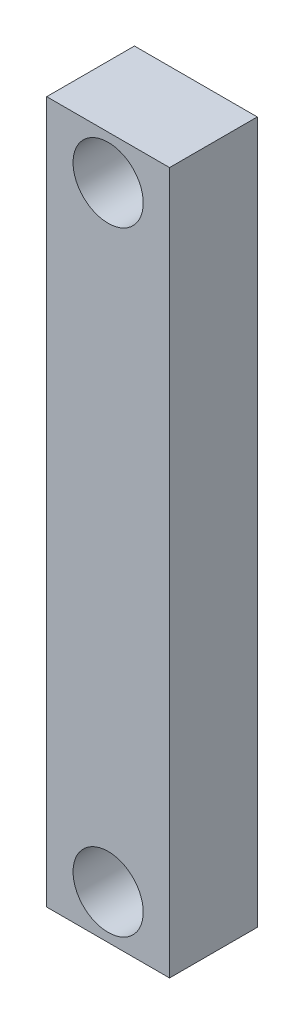
ISO-10303-21;
HEADER;
FILE_DESCRIPTION(('STEP AP214'),'2;1');
FILE_NAME('part.step','',(''),(''),'','','');
FILE_SCHEMA(('AUTOMOTIVE_DESIGN { 1 0 10303 214 1 1 1 1 }'));
ENDSEC;
DATA;
#1=APPLICATION_CONTEXT('core data for automotive mechanical design processes');
#2=APPLICATION_PROTOCOL_DEFINITION('international standard','automotive_design',2000,#1);
#3=PRODUCT_CONTEXT('',#1,'mechanical');
#4=PRODUCT('Part','Part','',(#3));
#5=PRODUCT_RELATED_PRODUCT_CATEGORY('part','',(#4));
#6=PRODUCT_DEFINITION_FORMATION('','',#4);
#7=PRODUCT_DEFINITION_CONTEXT('part definition',#1,'design');
#8=PRODUCT_DEFINITION('design','',#6,#7);
#9=PRODUCT_DEFINITION_SHAPE('','',#8);
#10=(LENGTH_UNIT() NAMED_UNIT(*) SI_UNIT(.MILLI.,.METRE.));
#11=(NAMED_UNIT(*) PLANE_ANGLE_UNIT() SI_UNIT($,.RADIAN.));
#12=(NAMED_UNIT(*) SI_UNIT($,.STERADIAN.) SOLID_ANGLE_UNIT());
#13=UNCERTAINTY_MEASURE_WITH_UNIT(LENGTH_MEASURE(1.E-05),#10,'distance_accuracy_value','');
#14=(GEOMETRIC_REPRESENTATION_CONTEXT(3) GLOBAL_UNCERTAINTY_ASSIGNED_CONTEXT((#13)) GLOBAL_UNIT_ASSIGNED_CONTEXT((#10,
#11,#12)) REPRESENTATION_CONTEXT('',''));
#15=CARTESIAN_POINT('',(0.,0.,0.));
#16=DIRECTION('',(0.,0.,1.));
#17=DIRECTION('',(1.,0.,0.));
#18=AXIS2_PLACEMENT_3D('',#15,#16,#17);
#19=CARTESIAN_POINT('',(0.,-17.5,5.));
#20=DIRECTION('',(0.,0.,-1.));
#21=DIRECTION('',(-1.,0.,0.));
#22=AXIS2_PLACEMENT_3D('',#19,#20,#21);
#23=CYLINDRICAL_SURFACE('',#22,2.);
#24=CARTESIAN_POINT('',(0.,-17.5,5.));
#25=DIRECTION('',(0.,0.,1.));
#26=DIRECTION('',(1.,0.,0.));
#27=AXIS2_PLACEMENT_3D('',#24,#25,#26);
#28=CIRCLE('',#27,2.);
#29=CARTESIAN_POINT('',(2.,-17.5,5.));
#30=VERTEX_POINT('',#29);
#31=EDGE_CURVE('E126',#30,#30,#28,.T.);
#32=ORIENTED_EDGE('',*,*,#31,.T.);
#33=EDGE_LOOP('',(#32));
#34=FACE_BOUND('',#33,.T.);
#35=CARTESIAN_POINT('',(0.,-17.5,2.));
#36=DIRECTION('',(0.,0.,-1.));
#37=DIRECTION('',(-1.,0.,0.));
#38=AXIS2_PLACEMENT_3D('',#35,#36,#37);
#39=CIRCLE('',#38,2.);
#40=CARTESIAN_POINT('',(-2.,-17.5,2.));
#41=VERTEX_POINT('',#40);
#42=EDGE_CURVE('E50',#41,#41,#39,.T.);
#43=ORIENTED_EDGE('',*,*,#42,.T.);
#44=EDGE_LOOP('',(#43));
#45=FACE_BOUND('',#44,.T.);
#46=ADVANCED_FACE('F43',(#34,#45),#23,.F.);
#47=CARTESIAN_POINT('',(0.,0.,5.));
#48=DIRECTION('',(0.,0.,1.));
#49=DIRECTION('',(1.,0.,0.));
#50=AXIS2_PLACEMENT_3D('',#47,#48,#49);
#51=PLANE('',#50);
#52=CARTESIAN_POINT('',(0.,17.5,5.));
#53=DIRECTION('',(0.,0.,1.));
#54=DIRECTION('',(1.,0.,0.));
#55=AXIS2_PLACEMENT_3D('',#52,#53,#54);
#56=CIRCLE('',#55,2.);
#57=CARTESIAN_POINT('',(2.,17.5,5.));
#58=VERTEX_POINT('',#57);
#59=EDGE_CURVE('E114',#58,#58,#56,.T.);
#60=ORIENTED_EDGE('',*,*,#59,.F.);
#61=EDGE_LOOP('',(#60));
#62=FACE_BOUND('',#61,.T.);
#63=DIRECTION('',(0.,1.,0.));
#64=VECTOR('',#63,1.);
#65=CARTESIAN_POINT('',(3.5,20.,5.));
#66=LINE('',#65,#64);
#67=CARTESIAN_POINT('',(3.5,-20.,5.));
#68=VERTEX_POINT('',#67);
#69=CARTESIAN_POINT('',(3.5,20.,5.));
#70=VERTEX_POINT('',#69);
#71=EDGE_CURVE('E100',#68,#70,#66,.T.);
#72=ORIENTED_EDGE('',*,*,#71,.T.);
#73=DIRECTION('',(-1.,0.,0.));
#74=VECTOR('',#73,1.);
#75=CARTESIAN_POINT('',(-3.5,20.,5.));
#76=LINE('',#75,#74);
#77=CARTESIAN_POINT('',(-3.5,20.,5.));
#78=VERTEX_POINT('',#77);
#79=EDGE_CURVE('E93',#70,#78,#76,.T.);
#80=ORIENTED_EDGE('',*,*,#79,.T.);
#81=DIRECTION('',(0.,-1.,0.));
#82=VECTOR('',#81,1.);
#83=CARTESIAN_POINT('',(-3.5,20.,5.));
#84=LINE('',#83,#82);
#85=CARTESIAN_POINT('',(-3.5,-20.,5.));
#86=VERTEX_POINT('',#85);
#87=EDGE_CURVE('E92',#78,#86,#84,.T.);
#88=ORIENTED_EDGE('',*,*,#87,.T.);
#89=DIRECTION('',(1.,0.,0.));
#90=VECTOR('',#89,1.);
#91=CARTESIAN_POINT('',(-3.5,-20.,5.));
#92=LINE('',#91,#90);
#93=EDGE_CURVE('E64',#86,#68,#92,.T.);
#94=ORIENTED_EDGE('',*,*,#93,.T.);
#95=EDGE_LOOP('',(#72,#80,#88,#94));
#96=FACE_BOUND('',#95,.T.);
#97=ORIENTED_EDGE('',*,*,#31,.F.);
#98=EDGE_LOOP('',(#97));
#99=FACE_BOUND('',#98,.T.);
#100=ADVANCED_FACE('F95',(#62,#96,#99),#51,.T.);
#101=CARTESIAN_POINT('',(0.,0.,0.));
#102=DIRECTION('',(0.,0.,1.));
#103=DIRECTION('',(1.,0.,0.));
#104=AXIS2_PLACEMENT_3D('',#101,#102,#103);
#105=PLANE('',#104);
#106=CARTESIAN_POINT('',(0.,-17.5,0.));
#107=DIRECTION('',(0.,0.,1.));
#108=DIRECTION('',(1.,0.,0.));
#109=AXIS2_PLACEMENT_3D('',#106,#107,#108);
#110=CIRCLE('',#109,1.5);
#111=CARTESIAN_POINT('',(1.5,-17.5,0.));
#112=VERTEX_POINT('',#111);
#113=EDGE_CURVE('E139',#112,#112,#110,.T.);
#114=ORIENTED_EDGE('',*,*,#113,.T.);
#115=EDGE_LOOP('',(#114));
#116=FACE_BOUND('',#115,.T.);
#117=DIRECTION('',(0.,1.,0.));
#118=VECTOR('',#117,1.);
#119=CARTESIAN_POINT('',(3.5,20.,0.));
#120=LINE('',#119,#118);
#121=CARTESIAN_POINT('',(3.5,-20.,0.));
#122=VERTEX_POINT('',#121);
#123=CARTESIAN_POINT('',(3.5,20.,0.));
#124=VERTEX_POINT('',#123);
#125=EDGE_CURVE('E109',#122,#124,#120,.T.);
#126=ORIENTED_EDGE('',*,*,#125,.F.);
#127=DIRECTION('',(1.,0.,0.));
#128=VECTOR('',#127,1.);
#129=CARTESIAN_POINT('',(-3.5,-20.,0.));
#130=LINE('',#129,#128);
#131=CARTESIAN_POINT('',(-3.5,-20.,0.));
#132=VERTEX_POINT('',#131);
#133=EDGE_CURVE('E83',#132,#122,#130,.T.);
#134=ORIENTED_EDGE('',*,*,#133,.F.);
#135=DIRECTION('',(0.,-1.,0.));
#136=VECTOR('',#135,1.);
#137=CARTESIAN_POINT('',(-3.5,20.,0.));
#138=LINE('',#137,#136);
#139=CARTESIAN_POINT('',(-3.5,20.,0.));
#140=VERTEX_POINT('',#139);
#141=EDGE_CURVE('E80',#140,#132,#138,.T.);
#142=ORIENTED_EDGE('',*,*,#141,.F.);
#143=DIRECTION('',(-1.,0.,0.));
#144=VECTOR('',#143,1.);
#145=CARTESIAN_POINT('',(-3.5,20.,0.));
#146=LINE('',#145,#144);
#147=EDGE_CURVE('E101',#124,#140,#146,.T.);
#148=ORIENTED_EDGE('',*,*,#147,.F.);
#149=EDGE_LOOP('',(#126,#134,#142,#148));
#150=FACE_BOUND('',#149,.T.);
#151=CARTESIAN_POINT('',(0.,17.5,0.));
#152=DIRECTION('',(0.,0.,1.));
#153=DIRECTION('',(1.,0.,0.));
#154=AXIS2_PLACEMENT_3D('',#151,#152,#153);
#155=CIRCLE('',#154,2.);
#156=CARTESIAN_POINT('',(2.,17.5,0.));
#157=VERTEX_POINT('',#156);
#158=EDGE_CURVE('E122',#157,#157,#155,.T.);
#159=ORIENTED_EDGE('',*,*,#158,.T.);
#160=EDGE_LOOP('',(#159));
#161=FACE_BOUND('',#160,.T.);
#162=ADVANCED_FACE('F124',(#116,#150,#161),#105,.F.);
#163=CARTESIAN_POINT('',(3.5,20.,5.));
#164=DIRECTION('',(-1.,0.,0.));
#165=DIRECTION('',(0.,-1.,0.));
#166=AXIS2_PLACEMENT_3D('',#163,#164,#165);
#167=PLANE('',#166);
#168=ORIENTED_EDGE('',*,*,#125,.T.);
#169=DIRECTION('',(0.,0.,-1.));
#170=VECTOR('',#169,1.);
#171=CARTESIAN_POINT('',(3.5,20.,5.));
#172=LINE('',#171,#170);
#173=EDGE_CURVE('E11',#70,#124,#172,.T.);
#174=ORIENTED_EDGE('',*,*,#173,.F.);
#175=ORIENTED_EDGE('',*,*,#71,.F.);
#176=DIRECTION('',(0.,0.,-1.));
#177=VECTOR('',#176,1.);
#178=CARTESIAN_POINT('',(3.5,-20.,5.));
#179=LINE('',#178,#177);
#180=EDGE_CURVE('E106',#68,#122,#179,.T.);
#181=ORIENTED_EDGE('',*,*,#180,.T.);
#182=EDGE_LOOP('',(#168,#174,#175,#181));
#183=FACE_BOUND('',#182,.T.);
#184=ADVANCED_FACE('F44',(#183),#167,.F.);
#185=CARTESIAN_POINT('',(-3.5,20.,5.));
#186=DIRECTION('',(0.,-1.,0.));
#187=DIRECTION('',(0.,0.,-1.));
#188=AXIS2_PLACEMENT_3D('',#185,#186,#187);
#189=PLANE('',#188);
#190=ORIENTED_EDGE('',*,*,#147,.T.);
#191=DIRECTION('',(0.,0.,-1.));
#192=VECTOR('',#191,1.);
#193=CARTESIAN_POINT('',(-3.5,20.,5.));
#194=LINE('',#193,#192);
#195=EDGE_CURVE('E52',#78,#140,#194,.T.);
#196=ORIENTED_EDGE('',*,*,#195,.F.);
#197=ORIENTED_EDGE('',*,*,#79,.F.);
#198=ORIENTED_EDGE('',*,*,#173,.T.);
#199=EDGE_LOOP('',(#190,#196,#197,#198));
#200=FACE_BOUND('',#199,.T.);
#201=ADVANCED_FACE('F99',(#200),#189,.F.);
#202=CARTESIAN_POINT('',(-3.5,20.,5.));
#203=DIRECTION('',(1.,0.,0.));
#204=DIRECTION('',(0.,1.,0.));
#205=AXIS2_PLACEMENT_3D('',#202,#203,#204);
#206=PLANE('',#205);
#207=ORIENTED_EDGE('',*,*,#141,.T.);
#208=DIRECTION('',(0.,0.,-1.));
#209=VECTOR('',#208,1.);
#210=CARTESIAN_POINT('',(-3.5,-20.,5.));
#211=LINE('',#210,#209);
#212=EDGE_CURVE('E105',#86,#132,#211,.T.);
#213=ORIENTED_EDGE('',*,*,#212,.F.);
#214=ORIENTED_EDGE('',*,*,#87,.F.);
#215=ORIENTED_EDGE('',*,*,#195,.T.);
#216=EDGE_LOOP('',(#207,#213,#214,#215));
#217=FACE_BOUND('',#216,.T.);
#218=ADVANCED_FACE('F102',(#217),#206,.F.);
#219=CARTESIAN_POINT('',(-3.5,-20.,5.));
#220=DIRECTION('',(0.,1.,0.));
#221=DIRECTION('',(0.,0.,1.));
#222=AXIS2_PLACEMENT_3D('',#219,#220,#221);
#223=PLANE('',#222);
#224=ORIENTED_EDGE('',*,*,#133,.T.);
#225=ORIENTED_EDGE('',*,*,#180,.F.);
#226=ORIENTED_EDGE('',*,*,#93,.F.);
#227=ORIENTED_EDGE('',*,*,#212,.T.);
#228=EDGE_LOOP('',(#224,#225,#226,#227));
#229=FACE_BOUND('',#228,.T.);
#230=ADVANCED_FACE('F120',(#229),#223,.F.);
#231=CARTESIAN_POINT('',(0.,17.5,5.));
#232=DIRECTION('',(0.,0.,-1.));
#233=DIRECTION('',(-1.,0.,0.));
#234=AXIS2_PLACEMENT_3D('',#231,#232,#233);
#235=CYLINDRICAL_SURFACE('',#234,2.);
#236=ORIENTED_EDGE('',*,*,#59,.T.);
#237=EDGE_LOOP('',(#236));
#238=FACE_BOUND('',#237,.T.);
#239=ORIENTED_EDGE('',*,*,#158,.F.);
#240=EDGE_LOOP('',(#239));
#241=FACE_BOUND('',#240,.T.);
#242=ADVANCED_FACE('F150',(#238,#241),#235,.F.);
#243=CARTESIAN_POINT('',(0.,-17.5,2.));
#244=DIRECTION('',(0.,0.,-1.));
#245=DIRECTION('',(-1.,0.,0.));
#246=AXIS2_PLACEMENT_3D('',#243,#244,#245);
#247=PLANE('',#246);
#248=CARTESIAN_POINT('',(0.,-17.5,2.));
#249=DIRECTION('',(0.,0.,1.));
#250=DIRECTION('',(1.,0.,0.));
#251=AXIS2_PLACEMENT_3D('',#248,#249,#250);
#252=CIRCLE('',#251,1.5);
#253=CARTESIAN_POINT('',(1.5,-17.5,2.));
#254=VERTEX_POINT('',#253);
#255=EDGE_CURVE('E135',#254,#254,#252,.T.);
#256=ORIENTED_EDGE('',*,*,#255,.F.);
#257=EDGE_LOOP('',(#256));
#258=FACE_BOUND('',#257,.T.);
#259=ORIENTED_EDGE('',*,*,#42,.F.);
#260=EDGE_LOOP('',(#259));
#261=FACE_BOUND('',#260,.T.);
#262=ADVANCED_FACE('F145',(#258,#261),#247,.F.);
#263=CARTESIAN_POINT('',(0.,-17.5,0.));
#264=DIRECTION('',(0.,0.,1.));
#265=DIRECTION('',(1.,0.,0.));
#266=AXIS2_PLACEMENT_3D('',#263,#264,#265);
#267=CYLINDRICAL_SURFACE('',#266,1.5);
#268=ORIENTED_EDGE('',*,*,#113,.F.);
#269=EDGE_LOOP('',(#268));
#270=FACE_BOUND('',#269,.T.);
#271=ORIENTED_EDGE('',*,*,#255,.T.);
#272=EDGE_LOOP('',(#271));
#273=FACE_BOUND('',#272,.T.);
#274=ADVANCED_FACE('F148',(#270,#273),#267,.F.);
#275=CLOSED_SHELL('',(#46,#100,#162,#184,#201,#218,#230,#242,#262,#274));
#276=MANIFOLD_SOLID_BREP('B2',#275);
#277=ADVANCED_BREP_SHAPE_REPRESENTATION('',(#18,#276),#14);
#278=SHAPE_DEFINITION_REPRESENTATION(#9,#277);
ENDSEC;
END-ISO-10303-21;
